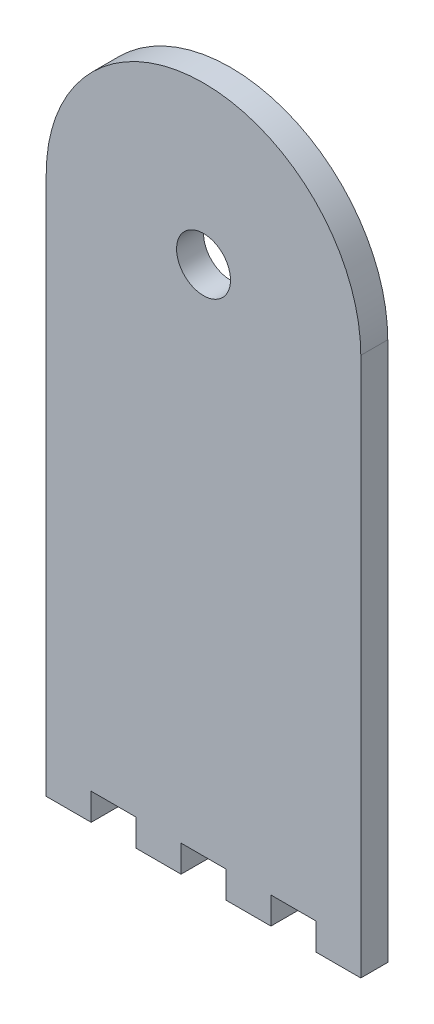
ISO-10303-21;
HEADER;
FILE_DESCRIPTION(('STEP AP214'),'2;1');
FILE_NAME('part.step','',(''),(''),'','','');
FILE_SCHEMA(('AUTOMOTIVE_DESIGN { 1 0 10303 214 1 1 1 1 }'));
ENDSEC;
DATA;
#1=APPLICATION_CONTEXT('core data for automotive mechanical design processes');
#2=APPLICATION_PROTOCOL_DEFINITION('international standard','automotive_design',2000,#1);
#3=PRODUCT_CONTEXT('',#1,'mechanical');
#4=PRODUCT('Part','Part','',(#3));
#5=PRODUCT_RELATED_PRODUCT_CATEGORY('part','',(#4));
#6=PRODUCT_DEFINITION_FORMATION('','',#4);
#7=PRODUCT_DEFINITION_CONTEXT('part definition',#1,'design');
#8=PRODUCT_DEFINITION('design','',#6,#7);
#9=PRODUCT_DEFINITION_SHAPE('','',#8);
#10=(LENGTH_UNIT() NAMED_UNIT(*) SI_UNIT(.MILLI.,.METRE.));
#11=(NAMED_UNIT(*) PLANE_ANGLE_UNIT() SI_UNIT($,.RADIAN.));
#12=(NAMED_UNIT(*) SI_UNIT($,.STERADIAN.) SOLID_ANGLE_UNIT());
#13=UNCERTAINTY_MEASURE_WITH_UNIT(LENGTH_MEASURE(1.E-05),#10,'distance_accuracy_value','');
#14=(GEOMETRIC_REPRESENTATION_CONTEXT(3) GLOBAL_UNCERTAINTY_ASSIGNED_CONTEXT((#13)) GLOBAL_UNIT_ASSIGNED_CONTEXT((#10,
#11,#12)) REPRESENTATION_CONTEXT('',''));
#15=CARTESIAN_POINT('',(0.,0.,0.));
#16=DIRECTION('',(0.,0.,1.));
#17=DIRECTION('',(1.,0.,0.));
#18=AXIS2_PLACEMENT_3D('',#15,#16,#17);
#19=CARTESIAN_POINT('',(17.5,0.,3.));
#20=DIRECTION('',(0.,0.,-1.));
#21=DIRECTION('',(-1.,0.,0.));
#22=AXIS2_PLACEMENT_3D('',#19,#20,#21);
#23=PLANE('',#22);
#24=CARTESIAN_POINT('',(17.5,0.,3.));
#25=DIRECTION('',(0.,0.,1.));
#26=DIRECTION('',(-1.,0.,0.));
#27=AXIS2_PLACEMENT_3D('',#24,#25,#26);
#28=CIRCLE('',#27,17.5);
#29=CARTESIAN_POINT('',(35.,0.,3.));
#30=VERTEX_POINT('',#29);
#31=CARTESIAN_POINT('',(0.,0.,3.));
#32=VERTEX_POINT('',#31);
#33=EDGE_CURVE('E209',#30,#32,#28,.T.);
#34=ORIENTED_EDGE('',*,*,#33,.T.);
#35=DIRECTION('',(0.,-1.,0.));
#36=VECTOR('',#35,1.);
#37=CARTESIAN_POINT('',(0.,-60.,3.));
#38=LINE('',#37,#36);
#39=CARTESIAN_POINT('',(0.,-60.,3.));
#40=VERTEX_POINT('',#39);
#41=EDGE_CURVE('E117',#32,#40,#38,.T.);
#42=ORIENTED_EDGE('',*,*,#41,.T.);
#43=DIRECTION('',(1.,0.,0.));
#44=VECTOR('',#43,1.);
#45=CARTESIAN_POINT('',(5.,-60.,3.));
#46=LINE('',#45,#44);
#47=CARTESIAN_POINT('',(5.,-60.,3.));
#48=VERTEX_POINT('',#47);
#49=EDGE_CURVE('E248',#40,#48,#46,.T.);
#50=ORIENTED_EDGE('',*,*,#49,.T.);
#51=DIRECTION('',(0.,1.,0.));
#52=VECTOR('',#51,1.);
#53=CARTESIAN_POINT('',(5.,-57.,3.));
#54=LINE('',#53,#52);
#55=CARTESIAN_POINT('',(5.,-57.,3.));
#56=VERTEX_POINT('',#55);
#57=EDGE_CURVE('E267',#48,#56,#54,.T.);
#58=ORIENTED_EDGE('',*,*,#57,.T.);
#59=DIRECTION('',(1.,0.,0.));
#60=VECTOR('',#59,1.);
#61=CARTESIAN_POINT('',(10.,-57.,3.));
#62=LINE('',#61,#60);
#63=CARTESIAN_POINT('',(10.,-57.,3.));
#64=VERTEX_POINT('',#63);
#65=EDGE_CURVE('E264',#56,#64,#62,.T.);
#66=ORIENTED_EDGE('',*,*,#65,.T.);
#67=DIRECTION('',(0.,-1.,0.));
#68=VECTOR('',#67,1.);
#69=CARTESIAN_POINT('',(10.,-60.,3.));
#70=LINE('',#69,#68);
#71=CARTESIAN_POINT('',(10.,-60.,3.));
#72=VERTEX_POINT('',#71);
#73=EDGE_CURVE('E266',#64,#72,#70,.T.);
#74=ORIENTED_EDGE('',*,*,#73,.T.);
#75=DIRECTION('',(1.,0.,0.));
#76=VECTOR('',#75,1.);
#77=CARTESIAN_POINT('',(15.,-60.,3.));
#78=LINE('',#77,#76);
#79=CARTESIAN_POINT('',(15.,-60.,3.));
#80=VERTEX_POINT('',#79);
#81=EDGE_CURVE('E269',#72,#80,#78,.T.);
#82=ORIENTED_EDGE('',*,*,#81,.T.);
#83=DIRECTION('',(0.,1.,0.));
#84=VECTOR('',#83,1.);
#85=CARTESIAN_POINT('',(15.,-57.,3.));
#86=LINE('',#85,#84);
#87=CARTESIAN_POINT('',(15.,-57.,3.));
#88=VERTEX_POINT('',#87);
#89=EDGE_CURVE('E275',#80,#88,#86,.T.);
#90=ORIENTED_EDGE('',*,*,#89,.T.);
#91=DIRECTION('',(1.,0.,0.));
#92=VECTOR('',#91,1.);
#93=CARTESIAN_POINT('',(20.,-57.,3.));
#94=LINE('',#93,#92);
#95=CARTESIAN_POINT('',(20.,-57.,3.));
#96=VERTEX_POINT('',#95);
#97=EDGE_CURVE('E277',#88,#96,#94,.T.);
#98=ORIENTED_EDGE('',*,*,#97,.T.);
#99=DIRECTION('',(0.,-1.,0.));
#100=VECTOR('',#99,1.);
#101=CARTESIAN_POINT('',(20.,-60.,3.));
#102=LINE('',#101,#100);
#103=CARTESIAN_POINT('',(20.,-60.,3.));
#104=VERTEX_POINT('',#103);
#105=EDGE_CURVE('E279',#96,#104,#102,.T.);
#106=ORIENTED_EDGE('',*,*,#105,.T.);
#107=DIRECTION('',(1.,0.,0.));
#108=VECTOR('',#107,1.);
#109=CARTESIAN_POINT('',(25.,-60.,3.));
#110=LINE('',#109,#108);
#111=CARTESIAN_POINT('',(25.,-60.,3.));
#112=VERTEX_POINT('',#111);
#113=EDGE_CURVE('E281',#104,#112,#110,.T.);
#114=ORIENTED_EDGE('',*,*,#113,.T.);
#115=DIRECTION('',(0.,1.,0.));
#116=VECTOR('',#115,1.);
#117=CARTESIAN_POINT('',(25.,-57.,3.));
#118=LINE('',#117,#116);
#119=CARTESIAN_POINT('',(25.,-57.,3.));
#120=VERTEX_POINT('',#119);
#121=EDGE_CURVE('E283',#112,#120,#118,.T.);
#122=ORIENTED_EDGE('',*,*,#121,.T.);
#123=DIRECTION('',(1.,0.,0.));
#124=VECTOR('',#123,1.);
#125=CARTESIAN_POINT('',(30.,-57.,3.));
#126=LINE('',#125,#124);
#127=CARTESIAN_POINT('',(30.,-57.,3.));
#128=VERTEX_POINT('',#127);
#129=EDGE_CURVE('E160',#120,#128,#126,.T.);
#130=ORIENTED_EDGE('',*,*,#129,.T.);
#131=DIRECTION('',(0.,-1.,0.));
#132=VECTOR('',#131,1.);
#133=CARTESIAN_POINT('',(30.,-60.,3.));
#134=LINE('',#133,#132);
#135=CARTESIAN_POINT('',(30.,-60.,3.));
#136=VERTEX_POINT('',#135);
#137=EDGE_CURVE('E154',#128,#136,#134,.T.);
#138=ORIENTED_EDGE('',*,*,#137,.T.);
#139=DIRECTION('',(1.,0.,0.));
#140=VECTOR('',#139,1.);
#141=CARTESIAN_POINT('',(35.,-60.,3.));
#142=LINE('',#141,#140);
#143=CARTESIAN_POINT('',(35.,-60.,3.));
#144=VERTEX_POINT('',#143);
#145=EDGE_CURVE('E158',#136,#144,#142,.T.);
#146=ORIENTED_EDGE('',*,*,#145,.T.);
#147=DIRECTION('',(0.,1.,0.));
#148=VECTOR('',#147,1.);
#149=CARTESIAN_POINT('',(35.,0.,3.));
#150=LINE('',#149,#148);
#151=EDGE_CURVE('E50',#144,#30,#150,.T.);
#152=ORIENTED_EDGE('',*,*,#151,.T.);
#153=EDGE_LOOP('',(#34,#42,#50,#58,#66,#74,#82,#90,#98,#106,#114,#122,#130,#138,#146,#152));
#154=FACE_BOUND('',#153,.T.);
#155=CARTESIAN_POINT('',(17.5,0.,3.));
#156=DIRECTION('',(0.,0.,1.));
#157=DIRECTION('',(1.,0.,0.));
#158=AXIS2_PLACEMENT_3D('',#155,#156,#157);
#159=CIRCLE('',#158,3.);
#160=CARTESIAN_POINT('',(20.5,0.,3.));
#161=VERTEX_POINT('',#160);
#162=EDGE_CURVE('E182',#161,#161,#159,.T.);
#163=ORIENTED_EDGE('',*,*,#162,.F.);
#164=EDGE_LOOP('',(#163));
#165=FACE_BOUND('',#164,.T.);
#166=ADVANCED_FACE('F33',(#154,#165),#23,.F.);
#167=CARTESIAN_POINT('',(17.5,0.,0.));
#168=DIRECTION('',(0.,0.,-1.));
#169=DIRECTION('',(-1.,0.,0.));
#170=AXIS2_PLACEMENT_3D('',#167,#168,#169);
#171=PLANE('',#170);
#172=CARTESIAN_POINT('',(17.5,0.,0.));
#173=DIRECTION('',(0.,0.,1.));
#174=DIRECTION('',(-1.,0.,0.));
#175=AXIS2_PLACEMENT_3D('',#172,#173,#174);
#176=CIRCLE('',#175,17.5);
#177=CARTESIAN_POINT('',(35.,0.,0.));
#178=VERTEX_POINT('',#177);
#179=CARTESIAN_POINT('',(0.,0.,0.));
#180=VERTEX_POINT('',#179);
#181=EDGE_CURVE('E178',#178,#180,#176,.T.);
#182=ORIENTED_EDGE('',*,*,#181,.F.);
#183=DIRECTION('',(0.,1.,0.));
#184=VECTOR('',#183,1.);
#185=CARTESIAN_POINT('',(35.,0.,0.));
#186=LINE('',#185,#184);
#187=CARTESIAN_POINT('',(35.,-60.,0.));
#188=VERTEX_POINT('',#187);
#189=EDGE_CURVE('E109',#188,#178,#186,.T.);
#190=ORIENTED_EDGE('',*,*,#189,.F.);
#191=DIRECTION('',(1.,0.,0.));
#192=VECTOR('',#191,1.);
#193=CARTESIAN_POINT('',(35.,-60.,0.));
#194=LINE('',#193,#192);
#195=CARTESIAN_POINT('',(30.,-60.,0.));
#196=VERTEX_POINT('',#195);
#197=EDGE_CURVE('E103',#196,#188,#194,.T.);
#198=ORIENTED_EDGE('',*,*,#197,.F.);
#199=DIRECTION('',(0.,-1.,0.));
#200=VECTOR('',#199,1.);
#201=CARTESIAN_POINT('',(30.,-60.,0.));
#202=LINE('',#201,#200);
#203=CARTESIAN_POINT('',(30.,-57.,0.));
#204=VERTEX_POINT('',#203);
#205=EDGE_CURVE('E168',#204,#196,#202,.T.);
#206=ORIENTED_EDGE('',*,*,#205,.F.);
#207=DIRECTION('',(1.,0.,0.));
#208=VECTOR('',#207,1.);
#209=CARTESIAN_POINT('',(30.,-57.,0.));
#210=LINE('',#209,#208);
#211=CARTESIAN_POINT('',(25.,-57.,0.));
#212=VERTEX_POINT('',#211);
#213=EDGE_CURVE('E204',#212,#204,#210,.T.);
#214=ORIENTED_EDGE('',*,*,#213,.F.);
#215=DIRECTION('',(0.,1.,0.));
#216=VECTOR('',#215,1.);
#217=CARTESIAN_POINT('',(25.,-57.,0.));
#218=LINE('',#217,#216);
#219=CARTESIAN_POINT('',(25.,-60.,0.));
#220=VERTEX_POINT('',#219);
#221=EDGE_CURVE('E202',#220,#212,#218,.T.);
#222=ORIENTED_EDGE('',*,*,#221,.F.);
#223=DIRECTION('',(1.,0.,0.));
#224=VECTOR('',#223,1.);
#225=CARTESIAN_POINT('',(25.,-60.,0.));
#226=LINE('',#225,#224);
#227=CARTESIAN_POINT('',(20.,-60.,0.));
#228=VERTEX_POINT('',#227);
#229=EDGE_CURVE('E200',#228,#220,#226,.T.);
#230=ORIENTED_EDGE('',*,*,#229,.F.);
#231=DIRECTION('',(0.,-1.,0.));
#232=VECTOR('',#231,1.);
#233=CARTESIAN_POINT('',(20.,-60.,0.));
#234=LINE('',#233,#232);
#235=CARTESIAN_POINT('',(20.,-57.,0.));
#236=VERTEX_POINT('',#235);
#237=EDGE_CURVE('E198',#236,#228,#234,.T.);
#238=ORIENTED_EDGE('',*,*,#237,.F.);
#239=DIRECTION('',(1.,0.,0.));
#240=VECTOR('',#239,1.);
#241=CARTESIAN_POINT('',(20.,-57.,0.));
#242=LINE('',#241,#240);
#243=CARTESIAN_POINT('',(15.,-57.,0.));
#244=VERTEX_POINT('',#243);
#245=EDGE_CURVE('E196',#244,#236,#242,.T.);
#246=ORIENTED_EDGE('',*,*,#245,.F.);
#247=DIRECTION('',(0.,1.,0.));
#248=VECTOR('',#247,1.);
#249=CARTESIAN_POINT('',(15.,-57.,0.));
#250=LINE('',#249,#248);
#251=CARTESIAN_POINT('',(15.,-60.,0.));
#252=VERTEX_POINT('',#251);
#253=EDGE_CURVE('E194',#252,#244,#250,.T.);
#254=ORIENTED_EDGE('',*,*,#253,.F.);
#255=DIRECTION('',(1.,0.,0.));
#256=VECTOR('',#255,1.);
#257=CARTESIAN_POINT('',(15.,-60.,0.));
#258=LINE('',#257,#256);
#259=CARTESIAN_POINT('',(10.,-60.,0.));
#260=VERTEX_POINT('',#259);
#261=EDGE_CURVE('E192',#260,#252,#258,.T.);
#262=ORIENTED_EDGE('',*,*,#261,.F.);
#263=DIRECTION('',(0.,-1.,0.));
#264=VECTOR('',#263,1.);
#265=CARTESIAN_POINT('',(10.,-60.,0.));
#266=LINE('',#265,#264);
#267=CARTESIAN_POINT('',(10.,-57.,0.));
#268=VERTEX_POINT('',#267);
#269=EDGE_CURVE('E190',#268,#260,#266,.T.);
#270=ORIENTED_EDGE('',*,*,#269,.F.);
#271=DIRECTION('',(1.,0.,0.));
#272=VECTOR('',#271,1.);
#273=CARTESIAN_POINT('',(10.,-57.,0.));
#274=LINE('',#273,#272);
#275=CARTESIAN_POINT('',(5.,-57.,0.));
#276=VERTEX_POINT('',#275);
#277=EDGE_CURVE('E188',#276,#268,#274,.T.);
#278=ORIENTED_EDGE('',*,*,#277,.F.);
#279=DIRECTION('',(0.,1.,0.));
#280=VECTOR('',#279,1.);
#281=CARTESIAN_POINT('',(5.,-57.,0.));
#282=LINE('',#281,#280);
#283=CARTESIAN_POINT('',(5.,-60.,0.));
#284=VERTEX_POINT('',#283);
#285=EDGE_CURVE('E186',#284,#276,#282,.T.);
#286=ORIENTED_EDGE('',*,*,#285,.F.);
#287=DIRECTION('',(1.,0.,0.));
#288=VECTOR('',#287,1.);
#289=CARTESIAN_POINT('',(5.,-60.,0.));
#290=LINE('',#289,#288);
#291=CARTESIAN_POINT('',(0.,-60.,0.));
#292=VERTEX_POINT('',#291);
#293=EDGE_CURVE('E184',#292,#284,#290,.T.);
#294=ORIENTED_EDGE('',*,*,#293,.F.);
#295=DIRECTION('',(0.,-1.,0.));
#296=VECTOR('',#295,1.);
#297=CARTESIAN_POINT('',(0.,-60.,0.));
#298=LINE('',#297,#296);
#299=EDGE_CURVE('E181',#180,#292,#298,.T.);
#300=ORIENTED_EDGE('',*,*,#299,.F.);
#301=EDGE_LOOP('',(#182,#190,#198,#206,#214,#222,#230,#238,#246,#254,#262,#270,#278,#286,#294,#300));
#302=FACE_BOUND('',#301,.T.);
#303=CARTESIAN_POINT('',(17.5,0.,0.));
#304=DIRECTION('',(0.,0.,1.));
#305=DIRECTION('',(1.,0.,0.));
#306=AXIS2_PLACEMENT_3D('',#303,#304,#305);
#307=CIRCLE('',#306,3.);
#308=CARTESIAN_POINT('',(20.5,0.,0.));
#309=VERTEX_POINT('',#308);
#310=EDGE_CURVE('E482',#309,#309,#307,.T.);
#311=ORIENTED_EDGE('',*,*,#310,.T.);
#312=EDGE_LOOP('',(#311));
#313=FACE_BOUND('',#312,.T.);
#314=ADVANCED_FACE('F252',(#302,#313),#171,.T.);
#315=CARTESIAN_POINT('',(17.5,0.,3.));
#316=DIRECTION('',(0.,0.,-1.));
#317=DIRECTION('',(-1.,0.,0.));
#318=AXIS2_PLACEMENT_3D('',#315,#316,#317);
#319=CYLINDRICAL_SURFACE('',#318,17.5);
#320=ORIENTED_EDGE('',*,*,#181,.T.);
#321=DIRECTION('',(0.,0.,-1.));
#322=VECTOR('',#321,1.);
#323=CARTESIAN_POINT('',(0.,0.,3.));
#324=LINE('',#323,#322);
#325=EDGE_CURVE('E11',#32,#180,#324,.T.);
#326=ORIENTED_EDGE('',*,*,#325,.F.);
#327=ORIENTED_EDGE('',*,*,#33,.F.);
#328=DIRECTION('',(0.,0.,-1.));
#329=VECTOR('',#328,1.);
#330=CARTESIAN_POINT('',(35.,0.,3.));
#331=LINE('',#330,#329);
#332=EDGE_CURVE('E174',#30,#178,#331,.T.);
#333=ORIENTED_EDGE('',*,*,#332,.T.);
#334=EDGE_LOOP('',(#320,#326,#327,#333));
#335=FACE_BOUND('',#334,.T.);
#336=ADVANCED_FACE('F35',(#335),#319,.T.);
#337=CARTESIAN_POINT('',(0.,-60.,3.));
#338=DIRECTION('',(1.,0.,0.));
#339=DIRECTION('',(0.,0.,-1.));
#340=AXIS2_PLACEMENT_3D('',#337,#338,#339);
#341=PLANE('',#340);
#342=ORIENTED_EDGE('',*,*,#299,.T.);
#343=DIRECTION('',(0.,0.,-1.));
#344=VECTOR('',#343,1.);
#345=CARTESIAN_POINT('',(0.,-60.,3.));
#346=LINE('',#345,#344);
#347=EDGE_CURVE('E42',#40,#292,#346,.T.);
#348=ORIENTED_EDGE('',*,*,#347,.F.);
#349=ORIENTED_EDGE('',*,*,#41,.F.);
#350=ORIENTED_EDGE('',*,*,#325,.T.);
#351=EDGE_LOOP('',(#342,#348,#349,#350));
#352=FACE_BOUND('',#351,.T.);
#353=ADVANCED_FACE('F317',(#352),#341,.F.);
#354=CARTESIAN_POINT('',(5.,-60.,3.));
#355=DIRECTION('',(0.,1.,0.));
#356=DIRECTION('',(0.,0.,1.));
#357=AXIS2_PLACEMENT_3D('',#354,#355,#356);
#358=PLANE('',#357);
#359=ORIENTED_EDGE('',*,*,#293,.T.);
#360=DIRECTION('',(0.,0.,-1.));
#361=VECTOR('',#360,1.);
#362=CARTESIAN_POINT('',(5.,-60.,3.));
#363=LINE('',#362,#361);
#364=EDGE_CURVE('E240',#48,#284,#363,.T.);
#365=ORIENTED_EDGE('',*,*,#364,.F.);
#366=ORIENTED_EDGE('',*,*,#49,.F.);
#367=ORIENTED_EDGE('',*,*,#347,.T.);
#368=EDGE_LOOP('',(#359,#365,#366,#367));
#369=FACE_BOUND('',#368,.T.);
#370=ADVANCED_FACE('F246',(#369),#358,.F.);
#371=CARTESIAN_POINT('',(5.,-57.,3.));
#372=DIRECTION('',(-1.,0.,0.));
#373=DIRECTION('',(0.,0.,1.));
#374=AXIS2_PLACEMENT_3D('',#371,#372,#373);
#375=PLANE('',#374);
#376=ORIENTED_EDGE('',*,*,#285,.T.);
#377=DIRECTION('',(0.,0.,-1.));
#378=VECTOR('',#377,1.);
#379=CARTESIAN_POINT('',(5.,-57.,3.));
#380=LINE('',#379,#378);
#381=EDGE_CURVE('E237',#56,#276,#380,.T.);
#382=ORIENTED_EDGE('',*,*,#381,.F.);
#383=ORIENTED_EDGE('',*,*,#57,.F.);
#384=ORIENTED_EDGE('',*,*,#364,.T.);
#385=EDGE_LOOP('',(#376,#382,#383,#384));
#386=FACE_BOUND('',#385,.T.);
#387=ADVANCED_FACE('F258',(#386),#375,.F.);
#388=CARTESIAN_POINT('',(10.,-57.,3.));
#389=DIRECTION('',(0.,1.,0.));
#390=DIRECTION('',(0.,0.,1.));
#391=AXIS2_PLACEMENT_3D('',#388,#389,#390);
#392=PLANE('',#391);
#393=ORIENTED_EDGE('',*,*,#277,.T.);
#394=DIRECTION('',(0.,0.,-1.));
#395=VECTOR('',#394,1.);
#396=CARTESIAN_POINT('',(10.,-57.,3.));
#397=LINE('',#396,#395);
#398=EDGE_CURVE('E234',#64,#268,#397,.T.);
#399=ORIENTED_EDGE('',*,*,#398,.F.);
#400=ORIENTED_EDGE('',*,*,#65,.F.);
#401=ORIENTED_EDGE('',*,*,#381,.T.);
#402=EDGE_LOOP('',(#393,#399,#400,#401));
#403=FACE_BOUND('',#402,.T.);
#404=ADVANCED_FACE('F262',(#403),#392,.F.);
#405=CARTESIAN_POINT('',(10.,-60.,3.));
#406=DIRECTION('',(1.,0.,0.));
#407=DIRECTION('',(0.,0.,-1.));
#408=AXIS2_PLACEMENT_3D('',#405,#406,#407);
#409=PLANE('',#408);
#410=ORIENTED_EDGE('',*,*,#269,.T.);
#411=DIRECTION('',(0.,0.,-1.));
#412=VECTOR('',#411,1.);
#413=CARTESIAN_POINT('',(10.,-60.,3.));
#414=LINE('',#413,#412);
#415=EDGE_CURVE('E231',#72,#260,#414,.T.);
#416=ORIENTED_EDGE('',*,*,#415,.F.);
#417=ORIENTED_EDGE('',*,*,#73,.F.);
#418=ORIENTED_EDGE('',*,*,#398,.T.);
#419=EDGE_LOOP('',(#410,#416,#417,#418));
#420=FACE_BOUND('',#419,.T.);
#421=ADVANCED_FACE('F330',(#420),#409,.F.);
#422=CARTESIAN_POINT('',(15.,-60.,3.));
#423=DIRECTION('',(0.,1.,0.));
#424=DIRECTION('',(0.,0.,1.));
#425=AXIS2_PLACEMENT_3D('',#422,#423,#424);
#426=PLANE('',#425);
#427=ORIENTED_EDGE('',*,*,#261,.T.);
#428=DIRECTION('',(0.,0.,-1.));
#429=VECTOR('',#428,1.);
#430=CARTESIAN_POINT('',(15.,-60.,3.));
#431=LINE('',#430,#429);
#432=EDGE_CURVE('E228',#80,#252,#431,.T.);
#433=ORIENTED_EDGE('',*,*,#432,.F.);
#434=ORIENTED_EDGE('',*,*,#81,.F.);
#435=ORIENTED_EDGE('',*,*,#415,.T.);
#436=EDGE_LOOP('',(#427,#433,#434,#435));
#437=FACE_BOUND('',#436,.T.);
#438=ADVANCED_FACE('F333',(#437),#426,.F.);
#439=CARTESIAN_POINT('',(15.,-57.,3.));
#440=DIRECTION('',(-1.,0.,0.));
#441=DIRECTION('',(0.,-1.,0.));
#442=AXIS2_PLACEMENT_3D('',#439,#440,#441);
#443=PLANE('',#442);
#444=ORIENTED_EDGE('',*,*,#253,.T.);
#445=DIRECTION('',(0.,0.,-1.));
#446=VECTOR('',#445,1.);
#447=CARTESIAN_POINT('',(15.,-57.,3.));
#448=LINE('',#447,#446);
#449=EDGE_CURVE('E225',#88,#244,#448,.T.);
#450=ORIENTED_EDGE('',*,*,#449,.F.);
#451=ORIENTED_EDGE('',*,*,#89,.F.);
#452=ORIENTED_EDGE('',*,*,#432,.T.);
#453=EDGE_LOOP('',(#444,#450,#451,#452));
#454=FACE_BOUND('',#453,.T.);
#455=ADVANCED_FACE('F337',(#454),#443,.F.);
#456=CARTESIAN_POINT('',(20.,-57.,3.));
#457=DIRECTION('',(0.,1.,0.));
#458=DIRECTION('',(0.,0.,1.));
#459=AXIS2_PLACEMENT_3D('',#456,#457,#458);
#460=PLANE('',#459);
#461=ORIENTED_EDGE('',*,*,#245,.T.);
#462=DIRECTION('',(0.,0.,-1.));
#463=VECTOR('',#462,1.);
#464=CARTESIAN_POINT('',(20.,-57.,3.));
#465=LINE('',#464,#463);
#466=EDGE_CURVE('E222',#96,#236,#465,.T.);
#467=ORIENTED_EDGE('',*,*,#466,.F.);
#468=ORIENTED_EDGE('',*,*,#97,.F.);
#469=ORIENTED_EDGE('',*,*,#449,.T.);
#470=EDGE_LOOP('',(#461,#467,#468,#469));
#471=FACE_BOUND('',#470,.T.);
#472=ADVANCED_FACE('F341',(#471),#460,.F.);
#473=CARTESIAN_POINT('',(20.,-60.,3.));
#474=DIRECTION('',(1.,0.,0.));
#475=DIRECTION('',(0.,0.,-1.));
#476=AXIS2_PLACEMENT_3D('',#473,#474,#475);
#477=PLANE('',#476);
#478=ORIENTED_EDGE('',*,*,#237,.T.);
#479=DIRECTION('',(0.,0.,-1.));
#480=VECTOR('',#479,1.);
#481=CARTESIAN_POINT('',(20.,-60.,3.));
#482=LINE('',#481,#480);
#483=EDGE_CURVE('E219',#104,#228,#482,.T.);
#484=ORIENTED_EDGE('',*,*,#483,.F.);
#485=ORIENTED_EDGE('',*,*,#105,.F.);
#486=ORIENTED_EDGE('',*,*,#466,.T.);
#487=EDGE_LOOP('',(#478,#484,#485,#486));
#488=FACE_BOUND('',#487,.T.);
#489=ADVANCED_FACE('F345',(#488),#477,.F.);
#490=CARTESIAN_POINT('',(25.,-60.,3.));
#491=DIRECTION('',(0.,1.,0.));
#492=DIRECTION('',(0.,0.,1.));
#493=AXIS2_PLACEMENT_3D('',#490,#491,#492);
#494=PLANE('',#493);
#495=ORIENTED_EDGE('',*,*,#229,.T.);
#496=DIRECTION('',(0.,0.,-1.));
#497=VECTOR('',#496,1.);
#498=CARTESIAN_POINT('',(25.,-60.,3.));
#499=LINE('',#498,#497);
#500=EDGE_CURVE('E216',#112,#220,#499,.T.);
#501=ORIENTED_EDGE('',*,*,#500,.F.);
#502=ORIENTED_EDGE('',*,*,#113,.F.);
#503=ORIENTED_EDGE('',*,*,#483,.T.);
#504=EDGE_LOOP('',(#495,#501,#502,#503));
#505=FACE_BOUND('',#504,.T.);
#506=ADVANCED_FACE('F349',(#505),#494,.F.);
#507=CARTESIAN_POINT('',(25.,-57.,3.));
#508=DIRECTION('',(-1.,0.,0.));
#509=DIRECTION('',(0.,0.,1.));
#510=AXIS2_PLACEMENT_3D('',#507,#508,#509);
#511=PLANE('',#510);
#512=ORIENTED_EDGE('',*,*,#221,.T.);
#513=DIRECTION('',(0.,0.,-1.));
#514=VECTOR('',#513,1.);
#515=CARTESIAN_POINT('',(25.,-57.,3.));
#516=LINE('',#515,#514);
#517=EDGE_CURVE('E213',#120,#212,#516,.T.);
#518=ORIENTED_EDGE('',*,*,#517,.F.);
#519=ORIENTED_EDGE('',*,*,#121,.F.);
#520=ORIENTED_EDGE('',*,*,#500,.T.);
#521=EDGE_LOOP('',(#512,#518,#519,#520));
#522=FACE_BOUND('',#521,.T.);
#523=ADVANCED_FACE('F289',(#522),#511,.F.);
#524=CARTESIAN_POINT('',(30.,-57.,3.));
#525=DIRECTION('',(0.,1.,0.));
#526=DIRECTION('',(0.,0.,1.));
#527=AXIS2_PLACEMENT_3D('',#524,#525,#526);
#528=PLANE('',#527);
#529=ORIENTED_EDGE('',*,*,#213,.T.);
#530=DIRECTION('',(0.,0.,-1.));
#531=VECTOR('',#530,1.);
#532=CARTESIAN_POINT('',(30.,-57.,3.));
#533=LINE('',#532,#531);
#534=EDGE_CURVE('E169',#128,#204,#533,.T.);
#535=ORIENTED_EDGE('',*,*,#534,.F.);
#536=ORIENTED_EDGE('',*,*,#129,.F.);
#537=ORIENTED_EDGE('',*,*,#517,.T.);
#538=EDGE_LOOP('',(#529,#535,#536,#537));
#539=FACE_BOUND('',#538,.T.);
#540=ADVANCED_FACE('F293',(#539),#528,.F.);
#541=CARTESIAN_POINT('',(30.,-60.,3.));
#542=DIRECTION('',(1.,0.,0.));
#543=DIRECTION('',(0.,0.,-1.));
#544=AXIS2_PLACEMENT_3D('',#541,#542,#543);
#545=PLANE('',#544);
#546=ORIENTED_EDGE('',*,*,#205,.T.);
#547=DIRECTION('',(0.,0.,-1.));
#548=VECTOR('',#547,1.);
#549=CARTESIAN_POINT('',(30.,-60.,3.));
#550=LINE('',#549,#548);
#551=EDGE_CURVE('E165',#136,#196,#550,.T.);
#552=ORIENTED_EDGE('',*,*,#551,.F.);
#553=ORIENTED_EDGE('',*,*,#137,.F.);
#554=ORIENTED_EDGE('',*,*,#534,.T.);
#555=EDGE_LOOP('',(#546,#552,#553,#554));
#556=FACE_BOUND('',#555,.T.);
#557=ADVANCED_FACE('F166',(#556),#545,.F.);
#558=CARTESIAN_POINT('',(35.,-60.,3.));
#559=DIRECTION('',(0.,1.,0.));
#560=DIRECTION('',(0.,0.,1.));
#561=AXIS2_PLACEMENT_3D('',#558,#559,#560);
#562=PLANE('',#561);
#563=ORIENTED_EDGE('',*,*,#197,.T.);
#564=DIRECTION('',(0.,0.,-1.));
#565=VECTOR('',#564,1.);
#566=CARTESIAN_POINT('',(35.,-60.,3.));
#567=LINE('',#566,#565);
#568=EDGE_CURVE('E170',#144,#188,#567,.T.);
#569=ORIENTED_EDGE('',*,*,#568,.F.);
#570=ORIENTED_EDGE('',*,*,#145,.F.);
#571=ORIENTED_EDGE('',*,*,#551,.T.);
#572=EDGE_LOOP('',(#563,#569,#570,#571));
#573=FACE_BOUND('',#572,.T.);
#574=ADVANCED_FACE('F172',(#573),#562,.F.);
#575=CARTESIAN_POINT('',(35.,0.,3.));
#576=DIRECTION('',(-1.,0.,0.));
#577=DIRECTION('',(0.,-1.,0.));
#578=AXIS2_PLACEMENT_3D('',#575,#576,#577);
#579=PLANE('',#578);
#580=ORIENTED_EDGE('',*,*,#189,.T.);
#581=ORIENTED_EDGE('',*,*,#332,.F.);
#582=ORIENTED_EDGE('',*,*,#151,.F.);
#583=ORIENTED_EDGE('',*,*,#568,.T.);
#584=EDGE_LOOP('',(#580,#581,#582,#583));
#585=FACE_BOUND('',#584,.T.);
#586=ADVANCED_FACE('F297',(#585),#579,.F.);
#587=CARTESIAN_POINT('',(17.5,0.,3.));
#588=DIRECTION('',(0.,0.,-1.));
#589=DIRECTION('',(-1.,0.,0.));
#590=AXIS2_PLACEMENT_3D('',#587,#588,#589);
#591=CYLINDRICAL_SURFACE('',#590,3.);
#592=ORIENTED_EDGE('',*,*,#162,.T.);
#593=EDGE_LOOP('',(#592));
#594=FACE_BOUND('',#593,.T.);
#595=ORIENTED_EDGE('',*,*,#310,.F.);
#596=EDGE_LOOP('',(#595));
#597=FACE_BOUND('',#596,.T.);
#598=ADVANCED_FACE('F299',(#594,#597),#591,.F.);
#599=CLOSED_SHELL('',(#166,#314,#336,#353,#370,#387,#404,#421,#438,#455,#472,#489,#506,#523,
#540,#557,#574,#586,#598));
#600=MANIFOLD_SOLID_BREP('B2',#599);
#601=ADVANCED_BREP_SHAPE_REPRESENTATION('',(#18,#600),#14);
#602=SHAPE_DEFINITION_REPRESENTATION(#9,#601);
ENDSEC;
END-ISO-10303-21;
